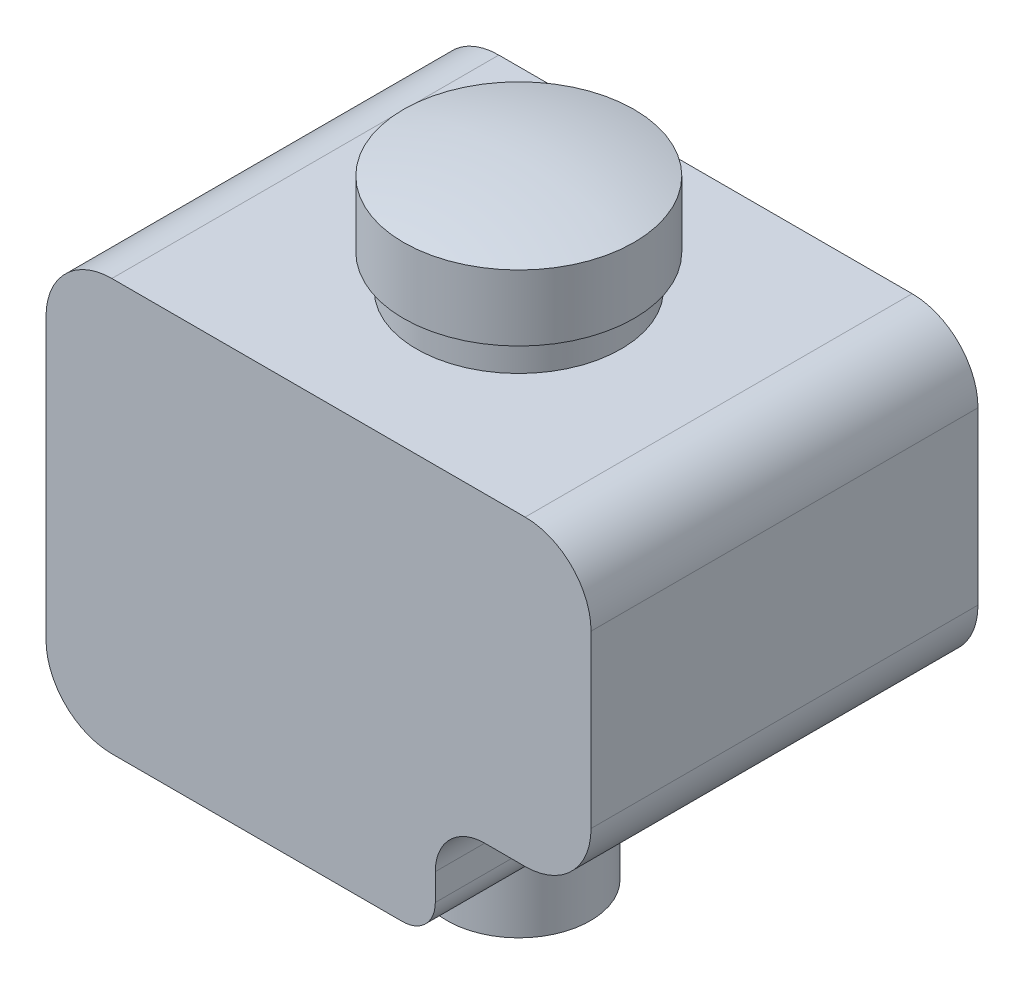
ISO-10303-21;
HEADER;
FILE_DESCRIPTION(('STEP AP214'),'2;1');
FILE_NAME('part.step','',(''),(''),'','','');
FILE_SCHEMA(('AUTOMOTIVE_DESIGN { 1 0 10303 214 1 1 1 1 }'));
ENDSEC;
DATA;
#1=APPLICATION_CONTEXT('core data for automotive mechanical design processes');
#2=APPLICATION_PROTOCOL_DEFINITION('international standard','automotive_design',2000,#1);
#3=PRODUCT_CONTEXT('',#1,'mechanical');
#4=PRODUCT('Part','Part','',(#3));
#5=PRODUCT_RELATED_PRODUCT_CATEGORY('part','',(#4));
#6=PRODUCT_DEFINITION_FORMATION('','',#4);
#7=PRODUCT_DEFINITION_CONTEXT('part definition',#1,'design');
#8=PRODUCT_DEFINITION('design','',#6,#7);
#9=PRODUCT_DEFINITION_SHAPE('','',#8);
#10=(LENGTH_UNIT() NAMED_UNIT(*) SI_UNIT(.MILLI.,.METRE.));
#11=(NAMED_UNIT(*) PLANE_ANGLE_UNIT() SI_UNIT($,.RADIAN.));
#12=(NAMED_UNIT(*) SI_UNIT($,.STERADIAN.) SOLID_ANGLE_UNIT());
#13=UNCERTAINTY_MEASURE_WITH_UNIT(LENGTH_MEASURE(1.E-05),#10,'distance_accuracy_value','');
#14=(GEOMETRIC_REPRESENTATION_CONTEXT(3) GLOBAL_UNCERTAINTY_ASSIGNED_CONTEXT((#13)) GLOBAL_UNIT_ASSIGNED_CONTEXT((#10,
#11,#12)) REPRESENTATION_CONTEXT('',''));
#15=CARTESIAN_POINT('',(0.,0.,0.));
#16=DIRECTION('',(0.,0.,1.));
#17=DIRECTION('',(1.,0.,0.));
#18=AXIS2_PLACEMENT_3D('',#15,#16,#17);
#19=CARTESIAN_POINT('',(1.04775,36.7637714304,-29.845));
#20=DIRECTION('',(0.,-1.,0.));
#21=DIRECTION('',(0.,0.,-1.));
#22=AXIS2_PLACEMENT_3D('',#19,#20,#21);
#23=PLANE('',#22);
#24=CARTESIAN_POINT('',(1.04775,36.7637714304,-29.845));
#25=DIRECTION('',(0.,-1.,0.));
#26=DIRECTION('',(0.,0.,-1.));
#27=AXIS2_PLACEMENT_3D('',#24,#25,#26);
#28=CIRCLE('',#27,17.78);
#29=CARTESIAN_POINT('',(1.04775,36.7637714304,-47.625));
#30=VERTEX_POINT('',#29);
#31=EDGE_CURVE('E195',#30,#30,#28,.T.);
#32=ORIENTED_EDGE('',*,*,#31,.T.);
#33=EDGE_LOOP('',(#32));
#34=FACE_BOUND('',#33,.T.);
#35=CARTESIAN_POINT('',(1.04775,36.7637714304,-29.845));
#36=DIRECTION('',(0.,-1.,0.));
#37=DIRECTION('',(0.,0.,-1.));
#38=AXIS2_PLACEMENT_3D('',#35,#36,#37);
#39=CIRCLE('',#38,15.77975);
#40=CARTESIAN_POINT('',(1.04775,36.7637714304,-45.62475));
#41=VERTEX_POINT('',#40);
#42=EDGE_CURVE('E191',#41,#41,#39,.T.);
#43=ORIENTED_EDGE('',*,*,#42,.F.);
#44=EDGE_LOOP('',(#43));
#45=FACE_BOUND('',#44,.T.);
#46=ADVANCED_FACE('F42',(#34,#45),#23,.T.);
#47=CARTESIAN_POINT('',(1.0477500083475,-14.0362285779475,-29.8449999999999));
#48=DIRECTION('',(0.,0.,1.));
#49=DIRECTION('',(-1.,0.,0.));
#50=AXIS2_PLACEMENT_3D('',#47,#48,#49);
#51=SPHERICAL_SURFACE('',#50,63.5);
#52=CARTESIAN_POINT('',(1.04775,46.9237714304,-29.845));
#53=DIRECTION('',(0.,1.,0.));
#54=DIRECTION('',(0.,0.,1.));
#55=AXIS2_PLACEMENT_3D('',#52,#53,#54);
#56=CIRCLE('',#55,17.78);
#57=CARTESIAN_POINT('',(1.04775,46.9237714304,-12.065));
#58=VERTEX_POINT('',#57);
#59=EDGE_CURVE('E153',#58,#58,#56,.F.);
#60=ORIENTED_EDGE('',*,*,#59,.F.);
#61=EDGE_LOOP('',(#60));
#62=FACE_BOUND('',#61,.T.);
#63=ADVANCED_FACE('F205',(#62),#51,.T.);
#64=CARTESIAN_POINT('',(1.04775,36.7637714304,-29.845));
#65=DIRECTION('',(0.,1.,0.));
#66=DIRECTION('',(0.,0.,1.));
#67=AXIS2_PLACEMENT_3D('',#64,#65,#66);
#68=CYLINDRICAL_SURFACE('',#67,17.78);
#69=ORIENTED_EDGE('',*,*,#31,.F.);
#70=EDGE_LOOP('',(#69));
#71=FACE_BOUND('',#70,.T.);
#72=ORIENTED_EDGE('',*,*,#59,.T.);
#73=EDGE_LOOP('',(#72));
#74=FACE_BOUND('',#73,.T.);
#75=ADVANCED_FACE('F209',(#71,#74),#68,.T.);
#76=CARTESIAN_POINT('',(1.04775,31.6837714304,-29.845));
#77=DIRECTION('',(0.,1.,0.));
#78=DIRECTION('',(0.,0.,1.));
#79=AXIS2_PLACEMENT_3D('',#76,#77,#78);
#80=CYLINDRICAL_SURFACE('',#79,15.77975);
#81=CARTESIAN_POINT('',(1.04775,31.6837714304,-29.845));
#82=DIRECTION('',(0.,-1.,0.));
#83=DIRECTION('',(0.,0.,-1.));
#84=AXIS2_PLACEMENT_3D('',#81,#82,#83);
#85=CIRCLE('',#84,15.77975);
#86=CARTESIAN_POINT('',(1.04775,31.6837714304,-45.62475));
#87=VERTEX_POINT('',#86);
#88=EDGE_CURVE('E192',#87,#87,#85,.T.);
#89=ORIENTED_EDGE('',*,*,#88,.F.);
#90=EDGE_LOOP('',(#89));
#91=FACE_BOUND('',#90,.T.);
#92=ORIENTED_EDGE('',*,*,#42,.T.);
#93=EDGE_LOOP('',(#92));
#94=FACE_BOUND('',#93,.T.);
#95=ADVANCED_FACE('F238',(#91,#94),#80,.T.);
#96=CARTESIAN_POINT('',(0.,31.6837714304,0.));
#97=DIRECTION('',(0.,1.,0.));
#98=DIRECTION('',(0.,0.,1.));
#99=AXIS2_PLACEMENT_3D('',#96,#97,#98);
#100=PLANE('',#99);
#101=ORIENTED_EDGE('',*,*,#88,.T.);
#102=EDGE_LOOP('',(#101));
#103=FACE_BOUND('',#102,.T.);
#104=DIRECTION('',(1.,0.,0.));
#105=VECTOR('',#104,1.);
#106=CARTESIAN_POINT('',(-14.732,31.6837714304,0.));
#107=LINE('',#106,#105);
#108=CARTESIAN_POINT('',(-31.877,31.6837714304,0.));
#109=VERTEX_POINT('',#108);
#110=CARTESIAN_POINT('',(31.877,31.6837714304,0.));
#111=VERTEX_POINT('',#110);
#112=EDGE_CURVE('E183',#109,#111,#107,.T.);
#113=ORIENTED_EDGE('',*,*,#112,.T.);
#114=DIRECTION('',(0.,0.,-1.));
#115=VECTOR('',#114,1.);
#116=CARTESIAN_POINT('',(31.877,31.6837714304,0.));
#117=LINE('',#116,#115);
#118=CARTESIAN_POINT('',(31.877,31.6837714304,-59.69));
#119=VERTEX_POINT('',#118);
#120=EDGE_CURVE('E326',#111,#119,#117,.T.);
#121=ORIENTED_EDGE('',*,*,#120,.T.);
#122=DIRECTION('',(1.,0.,0.));
#123=VECTOR('',#122,1.);
#124=CARTESIAN_POINT('',(42.037,31.6837714304,-59.69));
#125=LINE('',#124,#123);
#126=CARTESIAN_POINT('',(-31.877,31.6837714304,-59.69));
#127=VERTEX_POINT('',#126);
#128=EDGE_CURVE('E176',#127,#119,#125,.T.);
#129=ORIENTED_EDGE('',*,*,#128,.F.);
#130=DIRECTION('',(0.,0.,-1.));
#131=VECTOR('',#130,1.);
#132=CARTESIAN_POINT('',(-31.877,31.6837714304,0.));
#133=LINE('',#132,#131);
#134=EDGE_CURVE('E329',#127,#109,#133,.F.);
#135=ORIENTED_EDGE('',*,*,#134,.T.);
#136=EDGE_LOOP('',(#113,#121,#129,#135));
#137=FACE_BOUND('',#136,.T.);
#138=ADVANCED_FACE('F241',(#103,#137),#100,.T.);
#139=CARTESIAN_POINT('',(42.037,-31.8162285696,0.));
#140=DIRECTION('',(1.,0.,0.));
#141=DIRECTION('',(0.,0.,-1.));
#142=AXIS2_PLACEMENT_3D('',#139,#140,#141);
#143=PLANE('',#142);
#144=DIRECTION('',(0.,-1.,0.));
#145=VECTOR('',#144,1.);
#146=CARTESIAN_POINT('',(42.037,-31.8162285696,-59.69));
#147=LINE('',#146,#145);
#148=CARTESIAN_POINT('',(42.037,21.5237714304,-59.69));
#149=VERTEX_POINT('',#148);
#150=CARTESIAN_POINT('',(42.037,-4.8356759014,-59.69));
#151=VERTEX_POINT('',#150);
#152=EDGE_CURVE('E178',#149,#151,#147,.T.);
#153=ORIENTED_EDGE('',*,*,#152,.F.);
#154=DIRECTION('',(0.,0.,-1.));
#155=VECTOR('',#154,1.);
#156=CARTESIAN_POINT('',(42.037,21.5237714304,0.));
#157=LINE('',#156,#155);
#158=CARTESIAN_POINT('',(42.037,21.5237714304,0.));
#159=VERTEX_POINT('',#158);
#160=EDGE_CURVE('E295',#149,#159,#157,.F.);
#161=ORIENTED_EDGE('',*,*,#160,.T.);
#162=DIRECTION('',(0.,1.,0.));
#163=VECTOR('',#162,1.);
#164=CARTESIAN_POINT('',(42.037,-31.8162285696,0.));
#165=LINE('',#164,#163);
#166=CARTESIAN_POINT('',(42.037,-4.8356759014,0.));
#167=VERTEX_POINT('',#166);
#168=EDGE_CURVE('E186',#167,#159,#165,.T.);
#169=ORIENTED_EDGE('',*,*,#168,.F.);
#170=DIRECTION('',(0.,0.,-1.));
#171=VECTOR('',#170,1.);
#172=CARTESIAN_POINT('',(42.037,-4.8356759014,-59.69));
#173=LINE('',#172,#171);
#174=EDGE_CURVE('E294',#167,#151,#173,.T.);
#175=ORIENTED_EDGE('',*,*,#174,.T.);
#176=EDGE_LOOP('',(#153,#161,#169,#175));
#177=FACE_BOUND('',#176,.T.);
#178=ADVANCED_FACE('F247',(#177),#143,.T.);
#179=CARTESIAN_POINT('',(-14.732,-31.8162285696,0.));
#180=DIRECTION('',(0.,0.,1.));
#181=DIRECTION('',(1.,0.,0.));
#182=AXIS2_PLACEMENT_3D('',#179,#180,#181);
#183=PLANE('',#182);
#184=ORIENTED_EDGE('',*,*,#168,.T.);
#185=CARTESIAN_POINT('',(31.877,21.5237714304,0.));
#186=DIRECTION('',(0.,0.,1.));
#187=DIRECTION('',(1.,0.,0.));
#188=AXIS2_PLACEMENT_3D('',#185,#186,#187);
#189=CIRCLE('',#188,10.16);
#190=EDGE_CURVE('E302',#159,#111,#189,.T.);
#191=ORIENTED_EDGE('',*,*,#190,.T.);
#192=ORIENTED_EDGE('',*,*,#112,.F.);
#193=CARTESIAN_POINT('',(-31.877,21.5237714304,0.));
#194=DIRECTION('',(0.,0.,1.));
#195=DIRECTION('',(1.,0.,0.));
#196=AXIS2_PLACEMENT_3D('',#193,#194,#195);
#197=CIRCLE('',#196,10.16);
#198=CARTESIAN_POINT('',(-42.037,21.5237714304,0.));
#199=VERTEX_POINT('',#198);
#200=EDGE_CURVE('E57',#109,#199,#197,.T.);
#201=ORIENTED_EDGE('',*,*,#200,.T.);
#202=DIRECTION('',(0.,1.,0.));
#203=VECTOR('',#202,1.);
#204=CARTESIAN_POINT('',(-42.037,31.6837714304,0.));
#205=LINE('',#204,#203);
#206=CARTESIAN_POINT('',(-42.037,-21.6562285696,0.));
#207=VERTEX_POINT('',#206);
#208=EDGE_CURVE('E181',#207,#199,#205,.T.);
#209=ORIENTED_EDGE('',*,*,#208,.F.);
#210=CARTESIAN_POINT('',(-31.877,-21.6562285696,0.));
#211=DIRECTION('',(0.,0.,1.));
#212=DIRECTION('',(1.,0.,0.));
#213=AXIS2_PLACEMENT_3D('',#210,#211,#212);
#214=CIRCLE('',#213,10.16);
#215=CARTESIAN_POINT('',(-31.877,-31.8162285696,0.));
#216=VERTEX_POINT('',#215);
#217=EDGE_CURVE('E65',#207,#216,#214,.T.);
#218=ORIENTED_EDGE('',*,*,#217,.T.);
#219=DIRECTION('',(1.,0.,0.));
#220=VECTOR('',#219,1.);
#221=CARTESIAN_POINT('',(-14.732,-31.8162285696,0.));
#222=LINE('',#221,#220);
#223=CARTESIAN_POINT('',(12.9328056558,-31.8162285696,0.));
#224=VERTEX_POINT('',#223);
#225=EDGE_CURVE('E184',#216,#224,#222,.T.);
#226=ORIENTED_EDGE('',*,*,#225,.T.);
#227=CARTESIAN_POINT('',(12.9328056558,-26.7362285696,0.));
#228=DIRECTION('',(0.,0.,1.));
#229=DIRECTION('',(1.,0.,0.));
#230=AXIS2_PLACEMENT_3D('',#227,#228,#229);
#231=CIRCLE('',#230,5.08);
#232=CARTESIAN_POINT('',(18.0128056558,-26.7362285696,0.));
#233=VERTEX_POINT('',#232);
#234=EDGE_CURVE('E339',#224,#233,#231,.T.);
#235=ORIENTED_EDGE('',*,*,#234,.T.);
#236=DIRECTION('',(0.,1.,0.));
#237=VECTOR('',#236,1.);
#238=CARTESIAN_POINT('',(18.0128056558,-31.8162285696,0.));
#239=LINE('',#238,#237);
#240=CARTESIAN_POINT('',(18.0128056558,-22.6156759014,0.));
#241=VERTEX_POINT('',#240);
#242=EDGE_CURVE('E152',#233,#241,#239,.T.);
#243=ORIENTED_EDGE('',*,*,#242,.T.);
#244=CARTESIAN_POINT('',(25.6328056558,-22.6156759014,0.));
#245=DIRECTION('',(0.,0.,1.));
#246=DIRECTION('',(1.,0.,0.));
#247=AXIS2_PLACEMENT_3D('',#244,#245,#246);
#248=CIRCLE('',#247,7.62);
#249=CARTESIAN_POINT('',(25.6328056558,-14.9956759014,0.));
#250=VERTEX_POINT('',#249);
#251=EDGE_CURVE('E288',#241,#250,#248,.F.);
#252=ORIENTED_EDGE('',*,*,#251,.T.);
#253=DIRECTION('',(1.,0.,0.));
#254=VECTOR('',#253,1.);
#255=CARTESIAN_POINT('',(18.0128056558,-14.9956759014,0.));
#256=LINE('',#255,#254);
#257=CARTESIAN_POINT('',(31.877,-14.9956759014,0.));
#258=VERTEX_POINT('',#257);
#259=EDGE_CURVE('E168',#250,#258,#256,.T.);
#260=ORIENTED_EDGE('',*,*,#259,.T.);
#261=CARTESIAN_POINT('',(31.877,-4.8356759014,0.));
#262=DIRECTION('',(0.,0.,1.));
#263=DIRECTION('',(1.,0.,0.));
#264=AXIS2_PLACEMENT_3D('',#261,#262,#263);
#265=CIRCLE('',#264,10.16);
#266=EDGE_CURVE('E286',#258,#167,#265,.T.);
#267=ORIENTED_EDGE('',*,*,#266,.T.);
#268=EDGE_LOOP('',(#184,#191,#192,#201,#209,#218,#226,#235,#243,#252,#260,#267));
#269=FACE_BOUND('',#268,.T.);
#270=ADVANCED_FACE('F243',(#269),#183,.T.);
#271=CARTESIAN_POINT('',(0.,-31.8162285696,0.));
#272=DIRECTION('',(0.,1.,0.));
#273=DIRECTION('',(0.,0.,1.));
#274=AXIS2_PLACEMENT_3D('',#271,#272,#273);
#275=PLANE('',#274);
#276=CARTESIAN_POINT('',(1.04774999999999,-31.8162285696,-29.845));
#277=DIRECTION('',(0.,1.,0.));
#278=DIRECTION('',(-1.,0.,0.));
#279=AXIS2_PLACEMENT_3D('',#276,#277,#278);
#280=CIRCLE('',#279,11.049);
#281=CARTESIAN_POINT('',(-10.00125,-31.8162285696,-29.845));
#282=VERTEX_POINT('',#281);
#283=EDGE_CURVE('E165',#282,#282,#280,.T.);
#284=ORIENTED_EDGE('',*,*,#283,.T.);
#285=EDGE_LOOP('',(#284));
#286=FACE_BOUND('',#285,.T.);
#287=ORIENTED_EDGE('',*,*,#225,.F.);
#288=DIRECTION('',(0.,0.,1.));
#289=VECTOR('',#288,1.);
#290=CARTESIAN_POINT('',(-31.877,-31.8162285696,0.));
#291=LINE('',#290,#289);
#292=CARTESIAN_POINT('',(-31.877,-31.8162285696,-59.69));
#293=VERTEX_POINT('',#292);
#294=EDGE_CURVE('E50',#216,#293,#291,.F.);
#295=ORIENTED_EDGE('',*,*,#294,.T.);
#296=DIRECTION('',(-1.,0.,0.));
#297=VECTOR('',#296,1.);
#298=CARTESIAN_POINT('',(-42.037,-31.8162285696,-59.69));
#299=LINE('',#298,#297);
#300=CARTESIAN_POINT('',(12.9328056558,-31.8162285696,-59.69));
#301=VERTEX_POINT('',#300);
#302=EDGE_CURVE('E171',#301,#293,#299,.T.);
#303=ORIENTED_EDGE('',*,*,#302,.F.);
#304=DIRECTION('',(0.,0.,-1.));
#305=VECTOR('',#304,1.);
#306=CARTESIAN_POINT('',(12.9328056558,-31.8162285696,0.));
#307=LINE('',#306,#305);
#308=EDGE_CURVE('E139',#301,#224,#307,.F.);
#309=ORIENTED_EDGE('',*,*,#308,.T.);
#310=EDGE_LOOP('',(#287,#295,#303,#309));
#311=FACE_BOUND('',#310,.T.);
#312=ADVANCED_FACE('F246',(#286,#311),#275,.F.);
#313=CARTESIAN_POINT('',(-42.037,0.,0.));
#314=DIRECTION('',(1.,0.,0.));
#315=DIRECTION('',(0.,0.,-1.));
#316=AXIS2_PLACEMENT_3D('',#313,#314,#315);
#317=PLANE('',#316);
#318=DIRECTION('',(0.,1.,0.));
#319=VECTOR('',#318,1.);
#320=CARTESIAN_POINT('',(-42.037,31.6837714304,-59.69));
#321=LINE('',#320,#319);
#322=CARTESIAN_POINT('',(-42.037,-21.6562285696,-59.69));
#323=VERTEX_POINT('',#322);
#324=CARTESIAN_POINT('',(-42.037,21.5237714304,-59.69));
#325=VERTEX_POINT('',#324);
#326=EDGE_CURVE('E173',#323,#325,#321,.T.);
#327=ORIENTED_EDGE('',*,*,#326,.F.);
#328=DIRECTION('',(0.,0.,1.));
#329=VECTOR('',#328,1.);
#330=CARTESIAN_POINT('',(-42.037,-21.6562285696,0.));
#331=LINE('',#330,#329);
#332=EDGE_CURVE('E307',#323,#207,#331,.T.);
#333=ORIENTED_EDGE('',*,*,#332,.T.);
#334=ORIENTED_EDGE('',*,*,#208,.T.);
#335=DIRECTION('',(0.,0.,-1.));
#336=VECTOR('',#335,1.);
#337=CARTESIAN_POINT('',(-42.037,21.5237714304,-59.69));
#338=LINE('',#337,#336);
#339=EDGE_CURVE('E304',#199,#325,#338,.T.);
#340=ORIENTED_EDGE('',*,*,#339,.T.);
#341=EDGE_LOOP('',(#327,#333,#334,#340));
#342=FACE_BOUND('',#341,.T.);
#343=ADVANCED_FACE('F256',(#342),#317,.F.);
#344=CARTESIAN_POINT('',(0.,0.,-59.69));
#345=DIRECTION('',(0.,0.,1.));
#346=DIRECTION('',(1.,0.,0.));
#347=AXIS2_PLACEMENT_3D('',#344,#345,#346);
#348=PLANE('',#347);
#349=ORIENTED_EDGE('',*,*,#128,.T.);
#350=CARTESIAN_POINT('',(31.877,21.5237714304,-59.69));
#351=DIRECTION('',(0.,0.,1.));
#352=DIRECTION('',(1.,0.,0.));
#353=AXIS2_PLACEMENT_3D('',#350,#351,#352);
#354=CIRCLE('',#353,10.16);
#355=EDGE_CURVE('E313',#119,#149,#354,.F.);
#356=ORIENTED_EDGE('',*,*,#355,.T.);
#357=ORIENTED_EDGE('',*,*,#152,.T.);
#358=CARTESIAN_POINT('',(31.877,-4.8356759014,-59.69));
#359=DIRECTION('',(0.,0.,1.));
#360=DIRECTION('',(1.,0.,0.));
#361=AXIS2_PLACEMENT_3D('',#358,#359,#360);
#362=CIRCLE('',#361,10.16);
#363=CARTESIAN_POINT('',(31.877,-14.9956759014,-59.69));
#364=VERTEX_POINT('',#363);
#365=EDGE_CURVE('E317',#151,#364,#362,.F.);
#366=ORIENTED_EDGE('',*,*,#365,.T.);
#367=DIRECTION('',(1.,0.,0.));
#368=VECTOR('',#367,1.);
#369=CARTESIAN_POINT('',(18.0128056558,-14.9956759014,-59.69));
#370=LINE('',#369,#368);
#371=CARTESIAN_POINT('',(25.6328056558,-14.9956759014,-59.69));
#372=VERTEX_POINT('',#371);
#373=EDGE_CURVE('E159',#372,#364,#370,.T.);
#374=ORIENTED_EDGE('',*,*,#373,.F.);
#375=CARTESIAN_POINT('',(25.6328056558,-22.6156759014,-59.69));
#376=DIRECTION('',(0.,0.,1.));
#377=DIRECTION('',(1.,0.,0.));
#378=AXIS2_PLACEMENT_3D('',#375,#376,#377);
#379=CIRCLE('',#378,7.62);
#380=CARTESIAN_POINT('',(18.0128056558,-22.6156759014,-59.69));
#381=VERTEX_POINT('',#380);
#382=EDGE_CURVE('E158',#372,#381,#379,.T.);
#383=ORIENTED_EDGE('',*,*,#382,.T.);
#384=DIRECTION('',(0.,1.,0.));
#385=VECTOR('',#384,1.);
#386=CARTESIAN_POINT('',(18.0128056558,-31.8162285696,-59.69));
#387=LINE('',#386,#385);
#388=CARTESIAN_POINT('',(18.0128056558,-26.7362285696,-59.69));
#389=VERTEX_POINT('',#388);
#390=EDGE_CURVE('E149',#389,#381,#387,.T.);
#391=ORIENTED_EDGE('',*,*,#390,.F.);
#392=CARTESIAN_POINT('',(12.9328056558,-26.7362285696,-59.69));
#393=DIRECTION('',(0.,0.,1.));
#394=DIRECTION('',(1.,0.,0.));
#395=AXIS2_PLACEMENT_3D('',#392,#393,#394);
#396=CIRCLE('',#395,5.08);
#397=EDGE_CURVE('E133',#389,#301,#396,.F.);
#398=ORIENTED_EDGE('',*,*,#397,.T.);
#399=ORIENTED_EDGE('',*,*,#302,.T.);
#400=CARTESIAN_POINT('',(-31.877,-21.6562285696,-59.69));
#401=DIRECTION('',(0.,0.,1.));
#402=DIRECTION('',(1.,0.,0.));
#403=AXIS2_PLACEMENT_3D('',#400,#401,#402);
#404=CIRCLE('',#403,10.16);
#405=EDGE_CURVE('E311',#293,#323,#404,.F.);
#406=ORIENTED_EDGE('',*,*,#405,.T.);
#407=ORIENTED_EDGE('',*,*,#326,.T.);
#408=CARTESIAN_POINT('',(-31.877,21.5237714304,-59.69));
#409=DIRECTION('',(0.,0.,1.));
#410=DIRECTION('',(1.,0.,0.));
#411=AXIS2_PLACEMENT_3D('',#408,#409,#410);
#412=CIRCLE('',#411,10.16);
#413=EDGE_CURVE('E314',#325,#127,#412,.F.);
#414=ORIENTED_EDGE('',*,*,#413,.T.);
#415=EDGE_LOOP('',(#349,#356,#357,#366,#374,#383,#391,#398,#399,#406,#407,#414));
#416=FACE_BOUND('',#415,.T.);
#417=ADVANCED_FACE('F156',(#416),#348,.F.);
#418=CARTESIAN_POINT('',(18.0128056558,-31.8162285696,0.));
#419=DIRECTION('',(-1.,0.,0.));
#420=DIRECTION('',(0.,0.,1.));
#421=AXIS2_PLACEMENT_3D('',#418,#419,#420);
#422=PLANE('',#421);
#423=ORIENTED_EDGE('',*,*,#390,.T.);
#424=DIRECTION('',(0.,0.,-1.));
#425=VECTOR('',#424,1.);
#426=CARTESIAN_POINT('',(18.0128056558,-22.6156759014,0.));
#427=LINE('',#426,#425);
#428=EDGE_CURVE('E335',#381,#241,#427,.F.);
#429=ORIENTED_EDGE('',*,*,#428,.T.);
#430=ORIENTED_EDGE('',*,*,#242,.F.);
#431=DIRECTION('',(0.,0.,-1.));
#432=VECTOR('',#431,1.);
#433=CARTESIAN_POINT('',(18.0128056558,-26.7362285696,0.));
#434=LINE('',#433,#432);
#435=EDGE_CURVE('E137',#233,#389,#434,.T.);
#436=ORIENTED_EDGE('',*,*,#435,.T.);
#437=EDGE_LOOP('',(#423,#429,#430,#436));
#438=FACE_BOUND('',#437,.T.);
#439=ADVANCED_FACE('F148',(#438),#422,.F.);
#440=CARTESIAN_POINT('',(18.0128056558,-14.9956759014,0.));
#441=DIRECTION('',(0.,1.,0.));
#442=DIRECTION('',(-1.,0.,0.));
#443=AXIS2_PLACEMENT_3D('',#440,#441,#442);
#444=PLANE('',#443);
#445=ORIENTED_EDGE('',*,*,#373,.T.);
#446=DIRECTION('',(0.,0.,-1.));
#447=VECTOR('',#446,1.);
#448=CARTESIAN_POINT('',(31.877,-14.9956759014,0.));
#449=LINE('',#448,#447);
#450=EDGE_CURVE('E12',#364,#258,#449,.F.);
#451=ORIENTED_EDGE('',*,*,#450,.T.);
#452=ORIENTED_EDGE('',*,*,#259,.F.);
#453=DIRECTION('',(0.,0.,-1.));
#454=VECTOR('',#453,1.);
#455=CARTESIAN_POINT('',(25.6328056558,-14.9956759014,-59.69));
#456=LINE('',#455,#454);
#457=EDGE_CURVE('E337',#250,#372,#456,.T.);
#458=ORIENTED_EDGE('',*,*,#457,.T.);
#459=EDGE_LOOP('',(#445,#451,#452,#458));
#460=FACE_BOUND('',#459,.T.);
#461=ADVANCED_FACE('F265',(#460),#444,.F.);
#462=CARTESIAN_POINT('',(1.04775,-47.0562285696,-29.845));
#463=DIRECTION('',(0.,1.,0.));
#464=DIRECTION('',(-1.,0.,0.));
#465=AXIS2_PLACEMENT_3D('',#462,#463,#464);
#466=CYLINDRICAL_SURFACE('',#465,11.049);
#467=CARTESIAN_POINT('',(1.04775,-47.0562285696,-29.845));
#468=DIRECTION('',(0.,1.,0.));
#469=DIRECTION('',(-1.,0.,0.));
#470=AXIS2_PLACEMENT_3D('',#467,#468,#469);
#471=CIRCLE('',#470,11.049);
#472=CARTESIAN_POINT('',(-10.00125,-47.0562285696,-29.845));
#473=VERTEX_POINT('',#472);
#474=EDGE_CURVE('E160',#473,#473,#471,.T.);
#475=ORIENTED_EDGE('',*,*,#474,.T.);
#476=EDGE_LOOP('',(#475));
#477=FACE_BOUND('',#476,.T.);
#478=ORIENTED_EDGE('',*,*,#283,.F.);
#479=EDGE_LOOP('',(#478));
#480=FACE_BOUND('',#479,.T.);
#481=ADVANCED_FACE('F268',(#477,#480),#466,.T.);
#482=CARTESIAN_POINT('',(12.09675,-47.0562285696,-29.845));
#483=DIRECTION('',(0.,-1.,0.));
#484=DIRECTION('',(1.,0.,0.));
#485=AXIS2_PLACEMENT_3D('',#482,#483,#484);
#486=PLANE('',#485);
#487=ORIENTED_EDGE('',*,*,#474,.F.);
#488=EDGE_LOOP('',(#487));
#489=FACE_BOUND('',#488,.T.);
#490=ADVANCED_FACE('F215',(#489),#486,.T.);
#491=CARTESIAN_POINT('',(12.9328056558,-26.7362285696,0.));
#492=DIRECTION('',(0.,0.,-1.));
#493=DIRECTION('',(-1.,0.,0.));
#494=AXIS2_PLACEMENT_3D('',#491,#492,#493);
#495=CYLINDRICAL_SURFACE('',#494,5.08);
#496=ORIENTED_EDGE('',*,*,#234,.F.);
#497=ORIENTED_EDGE('',*,*,#308,.F.);
#498=ORIENTED_EDGE('',*,*,#397,.F.);
#499=ORIENTED_EDGE('',*,*,#435,.F.);
#500=EDGE_LOOP('',(#496,#497,#498,#499));
#501=FACE_BOUND('',#500,.T.);
#502=ADVANCED_FACE('F136',(#501),#495,.T.);
#503=CARTESIAN_POINT('',(25.6328056558,-22.6156759014,0.));
#504=DIRECTION('',(0.,0.,1.));
#505=DIRECTION('',(1.,0.,0.));
#506=AXIS2_PLACEMENT_3D('',#503,#504,#505);
#507=CYLINDRICAL_SURFACE('',#506,7.62);
#508=ORIENTED_EDGE('',*,*,#251,.F.);
#509=ORIENTED_EDGE('',*,*,#428,.F.);
#510=ORIENTED_EDGE('',*,*,#382,.F.);
#511=ORIENTED_EDGE('',*,*,#457,.F.);
#512=EDGE_LOOP('',(#508,#509,#510,#511));
#513=FACE_BOUND('',#512,.T.);
#514=ADVANCED_FACE('F214',(#513),#507,.F.);
#515=CARTESIAN_POINT('',(31.877,21.5237714304,0.));
#516=DIRECTION('',(0.,0.,-1.));
#517=DIRECTION('',(-1.,0.,0.));
#518=AXIS2_PLACEMENT_3D('',#515,#516,#517);
#519=CYLINDRICAL_SURFACE('',#518,10.16);
#520=ORIENTED_EDGE('',*,*,#190,.F.);
#521=ORIENTED_EDGE('',*,*,#160,.F.);
#522=ORIENTED_EDGE('',*,*,#355,.F.);
#523=ORIENTED_EDGE('',*,*,#120,.F.);
#524=EDGE_LOOP('',(#520,#521,#522,#523));
#525=FACE_BOUND('',#524,.T.);
#526=ADVANCED_FACE('F218',(#525),#519,.T.);
#527=CARTESIAN_POINT('',(-31.877,-21.6562285696,0.));
#528=DIRECTION('',(0.,0.,1.));
#529=DIRECTION('',(1.,0.,0.));
#530=AXIS2_PLACEMENT_3D('',#527,#528,#529);
#531=CYLINDRICAL_SURFACE('',#530,10.16);
#532=ORIENTED_EDGE('',*,*,#405,.F.);
#533=ORIENTED_EDGE('',*,*,#294,.F.);
#534=ORIENTED_EDGE('',*,*,#217,.F.);
#535=ORIENTED_EDGE('',*,*,#332,.F.);
#536=EDGE_LOOP('',(#532,#533,#534,#535));
#537=FACE_BOUND('',#536,.T.);
#538=ADVANCED_FACE('F222',(#537),#531,.T.);
#539=CARTESIAN_POINT('',(-31.877,21.5237714304,0.));
#540=DIRECTION('',(0.,0.,1.));
#541=DIRECTION('',(1.,0.,0.));
#542=AXIS2_PLACEMENT_3D('',#539,#540,#541);
#543=CYLINDRICAL_SURFACE('',#542,10.16);
#544=ORIENTED_EDGE('',*,*,#200,.F.);
#545=ORIENTED_EDGE('',*,*,#134,.F.);
#546=ORIENTED_EDGE('',*,*,#413,.F.);
#547=ORIENTED_EDGE('',*,*,#339,.F.);
#548=EDGE_LOOP('',(#544,#545,#546,#547));
#549=FACE_BOUND('',#548,.T.);
#550=ADVANCED_FACE('F225',(#549),#543,.T.);
#551=CARTESIAN_POINT('',(31.877,-4.8356759014,0.));
#552=DIRECTION('',(0.,0.,1.));
#553=DIRECTION('',(1.,0.,0.));
#554=AXIS2_PLACEMENT_3D('',#551,#552,#553);
#555=CYLINDRICAL_SURFACE('',#554,10.16);
#556=ORIENTED_EDGE('',*,*,#266,.F.);
#557=ORIENTED_EDGE('',*,*,#450,.F.);
#558=ORIENTED_EDGE('',*,*,#365,.F.);
#559=ORIENTED_EDGE('',*,*,#174,.F.);
#560=EDGE_LOOP('',(#556,#557,#558,#559));
#561=FACE_BOUND('',#560,.T.);
#562=ADVANCED_FACE('F44',(#561),#555,.T.);
#563=CLOSED_SHELL('',(#46,#63,#75,#95,#138,#178,#270,#312,#343,#417,#439,#461,#481,#490,#502,
#514,#526,#538,#550,#562));
#564=MANIFOLD_SOLID_BREP('B2',#563);
#565=ADVANCED_BREP_SHAPE_REPRESENTATION('',(#18,#564),#14);
#566=SHAPE_DEFINITION_REPRESENTATION(#9,#565);
ENDSEC;
END-ISO-10303-21;
